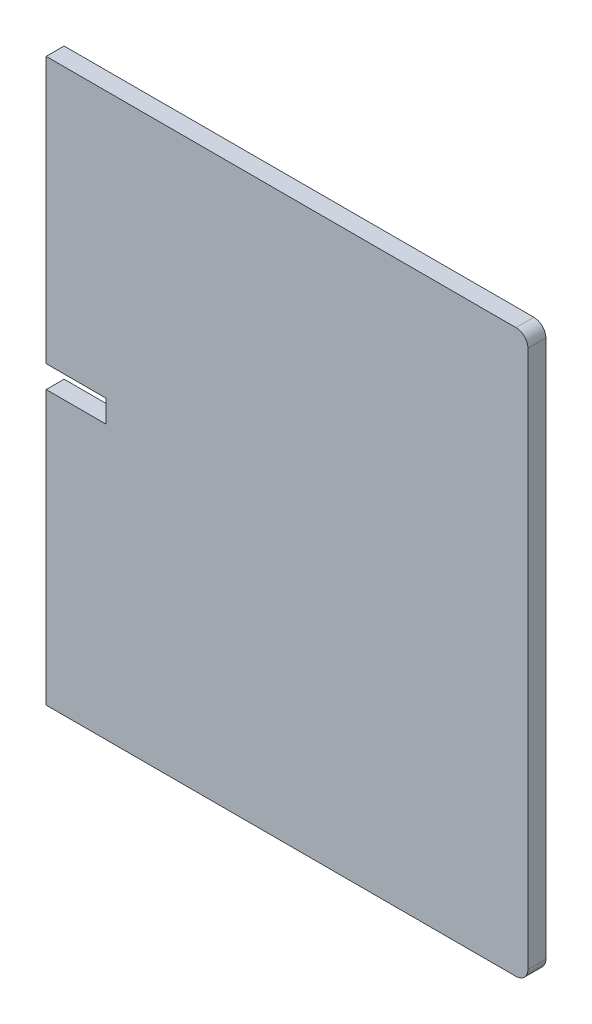
ISO-10303-21;
HEADER;
FILE_DESCRIPTION(('STEP AP214'),'2;1');
FILE_NAME('part.step','',(''),(''),'','','');
FILE_SCHEMA(('AUTOMOTIVE_DESIGN { 1 0 10303 214 1 1 1 1 }'));
ENDSEC;
DATA;
#1=APPLICATION_CONTEXT('core data for automotive mechanical design processes');
#2=APPLICATION_PROTOCOL_DEFINITION('international standard','automotive_design',2000,#1);
#3=PRODUCT_CONTEXT('',#1,'mechanical');
#4=PRODUCT('Part','Part','',(#3));
#5=PRODUCT_RELATED_PRODUCT_CATEGORY('part','',(#4));
#6=PRODUCT_DEFINITION_FORMATION('','',#4);
#7=PRODUCT_DEFINITION_CONTEXT('part definition',#1,'design');
#8=PRODUCT_DEFINITION('design','',#6,#7);
#9=PRODUCT_DEFINITION_SHAPE('','',#8);
#10=(LENGTH_UNIT() NAMED_UNIT(*) SI_UNIT(.MILLI.,.METRE.));
#11=(NAMED_UNIT(*) PLANE_ANGLE_UNIT() SI_UNIT($,.RADIAN.));
#12=(NAMED_UNIT(*) SI_UNIT($,.STERADIAN.) SOLID_ANGLE_UNIT());
#13=UNCERTAINTY_MEASURE_WITH_UNIT(LENGTH_MEASURE(1.E-05),#10,'distance_accuracy_value','');
#14=(GEOMETRIC_REPRESENTATION_CONTEXT(3) GLOBAL_UNCERTAINTY_ASSIGNED_CONTEXT((#13)) GLOBAL_UNIT_ASSIGNED_CONTEXT((#10,
#11,#12)) REPRESENTATION_CONTEXT('',''));
#15=CARTESIAN_POINT('',(0.,0.,0.));
#16=DIRECTION('',(0.,0.,1.));
#17=DIRECTION('',(1.,0.,0.));
#18=AXIS2_PLACEMENT_3D('',#15,#16,#17);
#19=CARTESIAN_POINT('',(66.3850473784245,-137.63794028616,3.81));
#20=DIRECTION('',(0.,0.,-1.));
#21=DIRECTION('',(-1.,0.,0.));
#22=AXIS2_PLACEMENT_3D('',#19,#20,#21);
#23=CYLINDRICAL_SURFACE('',#22,2.53999999999999);
#24=CARTESIAN_POINT('',(66.3850473784245,-137.63794028616,0.));
#25=DIRECTION('',(0.,0.,1.));
#26=DIRECTION('',(1.,0.,0.));
#27=AXIS2_PLACEMENT_3D('',#24,#25,#26);
#28=CIRCLE('',#27,2.53999999999999);
#29=CARTESIAN_POINT('',(68.9250473784245,-137.63794028616,0.));
#30=VERTEX_POINT('',#29);
#31=CARTESIAN_POINT('',(66.3850473784245,-140.17794028616,0.));
#32=VERTEX_POINT('',#31);
#33=EDGE_CURVE('E211',#30,#32,#28,.F.);
#34=ORIENTED_EDGE('',*,*,#33,.F.);
#35=DIRECTION('',(0.,0.,-1.));
#36=VECTOR('',#35,1.);
#37=CARTESIAN_POINT('',(68.9250473784245,-137.63794028616,3.81));
#38=LINE('',#37,#36);
#39=CARTESIAN_POINT('',(68.9250473784245,-137.63794028616,3.81));
#40=VERTEX_POINT('',#39);
#41=EDGE_CURVE('E13',#40,#30,#38,.T.);
#42=ORIENTED_EDGE('',*,*,#41,.F.);
#43=CARTESIAN_POINT('',(66.3850473784245,-137.63794028616,3.81));
#44=DIRECTION('',(0.,0.,1.));
#45=DIRECTION('',(1.,0.,0.));
#46=AXIS2_PLACEMENT_3D('',#43,#44,#45);
#47=CIRCLE('',#46,2.53999999999999);
#48=CARTESIAN_POINT('',(66.3850473784245,-140.17794028616,3.81));
#49=VERTEX_POINT('',#48);
#50=EDGE_CURVE('E170',#40,#49,#47,.F.);
#51=ORIENTED_EDGE('',*,*,#50,.T.);
#52=DIRECTION('',(0.,0.,-1.));
#53=VECTOR('',#52,1.);
#54=CARTESIAN_POINT('',(66.3850473784245,-140.17794028616,3.81));
#55=LINE('',#54,#53);
#56=EDGE_CURVE('E108',#49,#32,#55,.T.);
#57=ORIENTED_EDGE('',*,*,#56,.T.);
#58=EDGE_LOOP('',(#34,#42,#51,#57));
#59=FACE_BOUND('',#58,.T.);
#60=ADVANCED_FACE('F51',(#59),#23,.T.);
#61=CARTESIAN_POINT('',(68.9250473784245,0.,3.81));
#62=DIRECTION('',(1.,0.,0.));
#63=DIRECTION('',(0.,1.,0.));
#64=AXIS2_PLACEMENT_3D('',#61,#62,#63);
#65=PLANE('',#64);
#66=DIRECTION('',(0.,-1.,0.));
#67=VECTOR('',#66,1.);
#68=CARTESIAN_POINT('',(68.9250473784245,0.,0.));
#69=LINE('',#68,#67);
#70=CARTESIAN_POINT('',(68.9250473784245,-23.3379402861602,0.));
#71=VERTEX_POINT('',#70);
#72=EDGE_CURVE('E205',#71,#30,#69,.T.);
#73=ORIENTED_EDGE('',*,*,#72,.F.);
#74=DIRECTION('',(0.,0.,-1.));
#75=VECTOR('',#74,1.);
#76=CARTESIAN_POINT('',(68.9250473784245,-23.3379402861602,3.81));
#77=LINE('',#76,#75);
#78=CARTESIAN_POINT('',(68.9250473784245,-23.3379402861602,3.81));
#79=VERTEX_POINT('',#78);
#80=EDGE_CURVE('E59',#79,#71,#77,.T.);
#81=ORIENTED_EDGE('',*,*,#80,.F.);
#82=DIRECTION('',(0.,-1.,0.));
#83=VECTOR('',#82,1.);
#84=CARTESIAN_POINT('',(68.9250473784245,0.,3.81));
#85=LINE('',#84,#83);
#86=EDGE_CURVE('E165',#79,#40,#85,.T.);
#87=ORIENTED_EDGE('',*,*,#86,.T.);
#88=ORIENTED_EDGE('',*,*,#41,.T.);
#89=EDGE_LOOP('',(#73,#81,#87,#88));
#90=FACE_BOUND('',#89,.T.);
#91=ADVANCED_FACE('F210',(#90),#65,.T.);
#92=CARTESIAN_POINT('',(66.3850473784245,-23.3379402861602,3.81));
#93=DIRECTION('',(0.,0.,-1.));
#94=DIRECTION('',(-1.,0.,0.));
#95=AXIS2_PLACEMENT_3D('',#92,#93,#94);
#96=CYLINDRICAL_SURFACE('',#95,2.54000000000001);
#97=CARTESIAN_POINT('',(66.3850473784245,-23.3379402861602,0.));
#98=DIRECTION('',(0.,0.,1.));
#99=DIRECTION('',(1.,0.,0.));
#100=AXIS2_PLACEMENT_3D('',#97,#98,#99);
#101=CIRCLE('',#100,2.54000000000001);
#102=CARTESIAN_POINT('',(66.3850473784245,-20.7979402861602,0.));
#103=VERTEX_POINT('',#102);
#104=EDGE_CURVE('E197',#71,#103,#101,.T.);
#105=ORIENTED_EDGE('',*,*,#104,.T.);
#106=DIRECTION('',(0.,0.,-1.));
#107=VECTOR('',#106,1.);
#108=CARTESIAN_POINT('',(66.3850473784245,-20.7979402861602,3.81));
#109=LINE('',#108,#107);
#110=CARTESIAN_POINT('',(66.3850473784245,-20.7979402861602,3.81));
#111=VERTEX_POINT('',#110);
#112=EDGE_CURVE('E190',#111,#103,#109,.T.);
#113=ORIENTED_EDGE('',*,*,#112,.F.);
#114=CARTESIAN_POINT('',(66.3850473784245,-23.3379402861602,3.81));
#115=DIRECTION('',(0.,0.,1.));
#116=DIRECTION('',(1.,0.,0.));
#117=AXIS2_PLACEMENT_3D('',#114,#115,#116);
#118=CIRCLE('',#117,2.54000000000001);
#119=EDGE_CURVE('E163',#79,#111,#118,.T.);
#120=ORIENTED_EDGE('',*,*,#119,.F.);
#121=ORIENTED_EDGE('',*,*,#80,.T.);
#122=EDGE_LOOP('',(#105,#113,#120,#121));
#123=FACE_BOUND('',#122,.T.);
#124=ADVANCED_FACE('F195',(#123),#96,.T.);
#125=CARTESIAN_POINT('',(0.,-20.7979402861602,3.81));
#126=DIRECTION('',(0.,1.,0.));
#127=DIRECTION('',(0.,0.,1.));
#128=AXIS2_PLACEMENT_3D('',#125,#126,#127);
#129=PLANE('',#128);
#130=DIRECTION('',(1.,0.,0.));
#131=VECTOR('',#130,1.);
#132=CARTESIAN_POINT('',(0.,-20.7979402861602,0.));
#133=LINE('',#132,#131);
#134=CARTESIAN_POINT('',(-33.4369526215755,-20.7979402861602,0.));
#135=VERTEX_POINT('',#134);
#136=EDGE_CURVE('E208',#135,#103,#133,.T.);
#137=ORIENTED_EDGE('',*,*,#136,.F.);
#138=DIRECTION('',(0.,0.,-1.));
#139=VECTOR('',#138,1.);
#140=CARTESIAN_POINT('',(-33.4369526215755,-20.7979402861602,3.81));
#141=LINE('',#140,#139);
#142=CARTESIAN_POINT('',(-33.4369526215755,-20.7979402861602,3.81));
#143=VERTEX_POINT('',#142);
#144=EDGE_CURVE('E188',#143,#135,#141,.T.);
#145=ORIENTED_EDGE('',*,*,#144,.F.);
#146=DIRECTION('',(1.,0.,0.));
#147=VECTOR('',#146,1.);
#148=CARTESIAN_POINT('',(0.,-20.7979402861602,3.81));
#149=LINE('',#148,#147);
#150=EDGE_CURVE('E157',#143,#111,#149,.T.);
#151=ORIENTED_EDGE('',*,*,#150,.T.);
#152=ORIENTED_EDGE('',*,*,#112,.T.);
#153=EDGE_LOOP('',(#137,#145,#151,#152));
#154=FACE_BOUND('',#153,.T.);
#155=ADVANCED_FACE('F229',(#154),#129,.T.);
#156=CARTESIAN_POINT('',(-33.4369526215755,0.,3.81));
#157=DIRECTION('',(1.,0.,0.));
#158=DIRECTION('',(0.,1.,0.));
#159=AXIS2_PLACEMENT_3D('',#156,#157,#158);
#160=PLANE('',#159);
#161=DIRECTION('',(0.,-1.,0.));
#162=VECTOR('',#161,1.);
#163=CARTESIAN_POINT('',(-33.4369526215755,0.,0.));
#164=LINE('',#163,#162);
#165=CARTESIAN_POINT('',(-33.4369526215755,-77.3446902861602,0.));
#166=VERTEX_POINT('',#165);
#167=EDGE_CURVE('E177',#135,#166,#164,.T.);
#168=ORIENTED_EDGE('',*,*,#167,.T.);
#169=DIRECTION('',(0.,0.,-1.));
#170=VECTOR('',#169,1.);
#171=CARTESIAN_POINT('',(-33.4369526215755,-77.3446902861602,3.81));
#172=LINE('',#171,#170);
#173=CARTESIAN_POINT('',(-33.4369526215755,-77.3446902861602,3.81));
#174=VERTEX_POINT('',#173);
#175=EDGE_CURVE('E186',#174,#166,#172,.T.);
#176=ORIENTED_EDGE('',*,*,#175,.F.);
#177=DIRECTION('',(0.,-1.,0.));
#178=VECTOR('',#177,1.);
#179=CARTESIAN_POINT('',(-33.4369526215755,0.,3.81));
#180=LINE('',#179,#178);
#181=EDGE_CURVE('E152',#143,#174,#180,.T.);
#182=ORIENTED_EDGE('',*,*,#181,.F.);
#183=ORIENTED_EDGE('',*,*,#144,.T.);
#184=EDGE_LOOP('',(#168,#176,#182,#183));
#185=FACE_BOUND('',#184,.T.);
#186=ADVANCED_FACE('F228',(#185),#160,.F.);
#187=CARTESIAN_POINT('',(0.,-77.3446902861602,3.81));
#188=DIRECTION('',(0.,-1.,0.));
#189=DIRECTION('',(0.,0.,-1.));
#190=AXIS2_PLACEMENT_3D('',#187,#188,#189);
#191=PLANE('',#190);
#192=DIRECTION('',(-1.,0.,0.));
#193=VECTOR('',#192,1.);
#194=CARTESIAN_POINT('',(0.,-77.3446902861602,0.));
#195=LINE('',#194,#193);
#196=CARTESIAN_POINT('',(-20.7369526215755,-77.3446902861602,0.));
#197=VERTEX_POINT('',#196);
#198=EDGE_CURVE('E217',#197,#166,#195,.T.);
#199=ORIENTED_EDGE('',*,*,#198,.F.);
#200=DIRECTION('',(0.,0.,-1.));
#201=VECTOR('',#200,1.);
#202=CARTESIAN_POINT('',(-20.7369526215755,-77.3446902861602,3.81));
#203=LINE('',#202,#201);
#204=CARTESIAN_POINT('',(-20.7369526215755,-77.3446902861602,3.81));
#205=VERTEX_POINT('',#204);
#206=EDGE_CURVE('E184',#205,#197,#203,.T.);
#207=ORIENTED_EDGE('',*,*,#206,.F.);
#208=DIRECTION('',(-1.,0.,0.));
#209=VECTOR('',#208,1.);
#210=CARTESIAN_POINT('',(0.,-77.3446902861602,3.81));
#211=LINE('',#210,#209);
#212=EDGE_CURVE('E156',#205,#174,#211,.T.);
#213=ORIENTED_EDGE('',*,*,#212,.T.);
#214=ORIENTED_EDGE('',*,*,#175,.T.);
#215=EDGE_LOOP('',(#199,#207,#213,#214));
#216=FACE_BOUND('',#215,.T.);
#217=ADVANCED_FACE('F226',(#216),#191,.T.);
#218=CARTESIAN_POINT('',(-20.7369526215755,0.,3.81));
#219=DIRECTION('',(-1.,0.,0.));
#220=DIRECTION('',(0.,0.,1.));
#221=AXIS2_PLACEMENT_3D('',#218,#219,#220);
#222=PLANE('',#221);
#223=DIRECTION('',(0.,1.,0.));
#224=VECTOR('',#223,1.);
#225=CARTESIAN_POINT('',(-20.7369526215755,0.,0.));
#226=LINE('',#225,#224);
#227=CARTESIAN_POINT('',(-20.7369526215755,-82.1071902861602,0.));
#228=VERTEX_POINT('',#227);
#229=EDGE_CURVE('E219',#228,#197,#226,.T.);
#230=ORIENTED_EDGE('',*,*,#229,.F.);
#231=DIRECTION('',(0.,0.,-1.));
#232=VECTOR('',#231,1.);
#233=CARTESIAN_POINT('',(-20.7369526215755,-82.1071902861602,3.81));
#234=LINE('',#233,#232);
#235=CARTESIAN_POINT('',(-20.7369526215755,-82.1071902861602,3.81));
#236=VERTEX_POINT('',#235);
#237=EDGE_CURVE('E147',#236,#228,#234,.T.);
#238=ORIENTED_EDGE('',*,*,#237,.F.);
#239=DIRECTION('',(0.,1.,0.));
#240=VECTOR('',#239,1.);
#241=CARTESIAN_POINT('',(-20.7369526215755,0.,3.81));
#242=LINE('',#241,#240);
#243=EDGE_CURVE('E140',#236,#205,#242,.T.);
#244=ORIENTED_EDGE('',*,*,#243,.T.);
#245=ORIENTED_EDGE('',*,*,#206,.T.);
#246=EDGE_LOOP('',(#230,#238,#244,#245));
#247=FACE_BOUND('',#246,.T.);
#248=ADVANCED_FACE('F224',(#247),#222,.T.);
#249=CARTESIAN_POINT('',(0.,-82.1071902861602,3.81));
#250=DIRECTION('',(0.,-1.,0.));
#251=DIRECTION('',(0.,0.,-1.));
#252=AXIS2_PLACEMENT_3D('',#249,#250,#251);
#253=PLANE('',#252);
#254=DIRECTION('',(-1.,0.,0.));
#255=VECTOR('',#254,1.);
#256=CARTESIAN_POINT('',(0.,-82.1071902861602,0.));
#257=LINE('',#256,#255);
#258=CARTESIAN_POINT('',(-33.4369526215755,-82.1071902861602,0.));
#259=VERTEX_POINT('',#258);
#260=EDGE_CURVE('E146',#228,#259,#257,.T.);
#261=ORIENTED_EDGE('',*,*,#260,.T.);
#262=DIRECTION('',(0.,0.,-1.));
#263=VECTOR('',#262,1.);
#264=CARTESIAN_POINT('',(-33.4369526215755,-82.1071902861602,3.81));
#265=LINE('',#264,#263);
#266=CARTESIAN_POINT('',(-33.4369526215755,-82.1071902861602,3.81));
#267=VERTEX_POINT('',#266);
#268=EDGE_CURVE('E143',#267,#259,#265,.T.);
#269=ORIENTED_EDGE('',*,*,#268,.F.);
#270=DIRECTION('',(-1.,0.,0.));
#271=VECTOR('',#270,1.);
#272=CARTESIAN_POINT('',(0.,-82.1071902861602,3.81));
#273=LINE('',#272,#271);
#274=EDGE_CURVE('E133',#236,#267,#273,.T.);
#275=ORIENTED_EDGE('',*,*,#274,.F.);
#276=ORIENTED_EDGE('',*,*,#237,.T.);
#277=EDGE_LOOP('',(#261,#269,#275,#276));
#278=FACE_BOUND('',#277,.T.);
#279=ADVANCED_FACE('F144',(#278),#253,.F.);
#280=CARTESIAN_POINT('',(-33.4369526215755,-140.17794028616,0.));
#281=VERTEX_POINT('',#280);
#282=EDGE_CURVE('E101',#259,#281,#164,.T.);
#283=ORIENTED_EDGE('',*,*,#282,.T.);
#284=DIRECTION('',(0.,0.,-1.));
#285=VECTOR('',#284,1.);
#286=CARTESIAN_POINT('',(-33.4369526215755,-140.17794028616,3.81));
#287=LINE('',#286,#285);
#288=CARTESIAN_POINT('',(-33.4369526215755,-140.17794028616,3.81));
#289=VERTEX_POINT('',#288);
#290=EDGE_CURVE('E148',#289,#281,#287,.T.);
#291=ORIENTED_EDGE('',*,*,#290,.F.);
#292=EDGE_CURVE('E137',#267,#289,#180,.T.);
#293=ORIENTED_EDGE('',*,*,#292,.F.);
#294=ORIENTED_EDGE('',*,*,#268,.T.);
#295=EDGE_LOOP('',(#283,#291,#293,#294));
#296=FACE_BOUND('',#295,.T.);
#297=ADVANCED_FACE('F150',(#296),#160,.F.);
#298=CARTESIAN_POINT('',(0.,-140.17794028616,3.81));
#299=DIRECTION('',(0.,1.,0.));
#300=DIRECTION('',(0.,0.,1.));
#301=AXIS2_PLACEMENT_3D('',#298,#299,#300);
#302=PLANE('',#301);
#303=DIRECTION('',(1.,0.,0.));
#304=VECTOR('',#303,1.);
#305=CARTESIAN_POINT('',(0.,-140.17794028616,0.));
#306=LINE('',#305,#304);
#307=EDGE_CURVE('E171',#281,#32,#306,.T.);
#308=ORIENTED_EDGE('',*,*,#307,.T.);
#309=ORIENTED_EDGE('',*,*,#56,.F.);
#310=DIRECTION('',(1.,0.,0.));
#311=VECTOR('',#310,1.);
#312=CARTESIAN_POINT('',(0.,-140.17794028616,3.81));
#313=LINE('',#312,#311);
#314=EDGE_CURVE('E67',#289,#49,#313,.T.);
#315=ORIENTED_EDGE('',*,*,#314,.F.);
#316=ORIENTED_EDGE('',*,*,#290,.T.);
#317=EDGE_LOOP('',(#308,#309,#315,#316));
#318=FACE_BOUND('',#317,.T.);
#319=ADVANCED_FACE('F293',(#318),#302,.F.);
#320=CARTESIAN_POINT('',(0.,0.,3.81));
#321=DIRECTION('',(0.,0.,1.));
#322=DIRECTION('',(1.,0.,0.));
#323=AXIS2_PLACEMENT_3D('',#320,#321,#322);
#324=PLANE('',#323);
#325=ORIENTED_EDGE('',*,*,#50,.F.);
#326=ORIENTED_EDGE('',*,*,#86,.F.);
#327=ORIENTED_EDGE('',*,*,#119,.T.);
#328=ORIENTED_EDGE('',*,*,#150,.F.);
#329=ORIENTED_EDGE('',*,*,#181,.T.);
#330=ORIENTED_EDGE('',*,*,#212,.F.);
#331=ORIENTED_EDGE('',*,*,#243,.F.);
#332=ORIENTED_EDGE('',*,*,#274,.T.);
#333=ORIENTED_EDGE('',*,*,#292,.T.);
#334=ORIENTED_EDGE('',*,*,#314,.T.);
#335=EDGE_LOOP('',(#325,#326,#327,#328,#329,#330,#331,#332,#333,#334));
#336=FACE_BOUND('',#335,.T.);
#337=ADVANCED_FACE('F135',(#336),#324,.T.);
#338=CARTESIAN_POINT('',(0.,0.,0.));
#339=DIRECTION('',(0.,0.,1.));
#340=DIRECTION('',(1.,0.,0.));
#341=AXIS2_PLACEMENT_3D('',#338,#339,#340);
#342=PLANE('',#341);
#343=ORIENTED_EDGE('',*,*,#33,.T.);
#344=ORIENTED_EDGE('',*,*,#307,.F.);
#345=ORIENTED_EDGE('',*,*,#282,.F.);
#346=ORIENTED_EDGE('',*,*,#260,.F.);
#347=ORIENTED_EDGE('',*,*,#229,.T.);
#348=ORIENTED_EDGE('',*,*,#198,.T.);
#349=ORIENTED_EDGE('',*,*,#167,.F.);
#350=ORIENTED_EDGE('',*,*,#136,.T.);
#351=ORIENTED_EDGE('',*,*,#104,.F.);
#352=ORIENTED_EDGE('',*,*,#72,.T.);
#353=EDGE_LOOP('',(#343,#344,#345,#346,#347,#348,#349,#350,#351,#352));
#354=FACE_BOUND('',#353,.T.);
#355=ADVANCED_FACE('F204',(#354),#342,.F.);
#356=CLOSED_SHELL('',(#60,#91,#124,#155,#186,#217,#248,#279,#297,#319,#337,#355));
#357=MANIFOLD_SOLID_BREP('B2',#356);
#358=ADVANCED_BREP_SHAPE_REPRESENTATION('',(#18,#357),#14);
#359=SHAPE_DEFINITION_REPRESENTATION(#9,#358);
ENDSEC;
END-ISO-10303-21;
